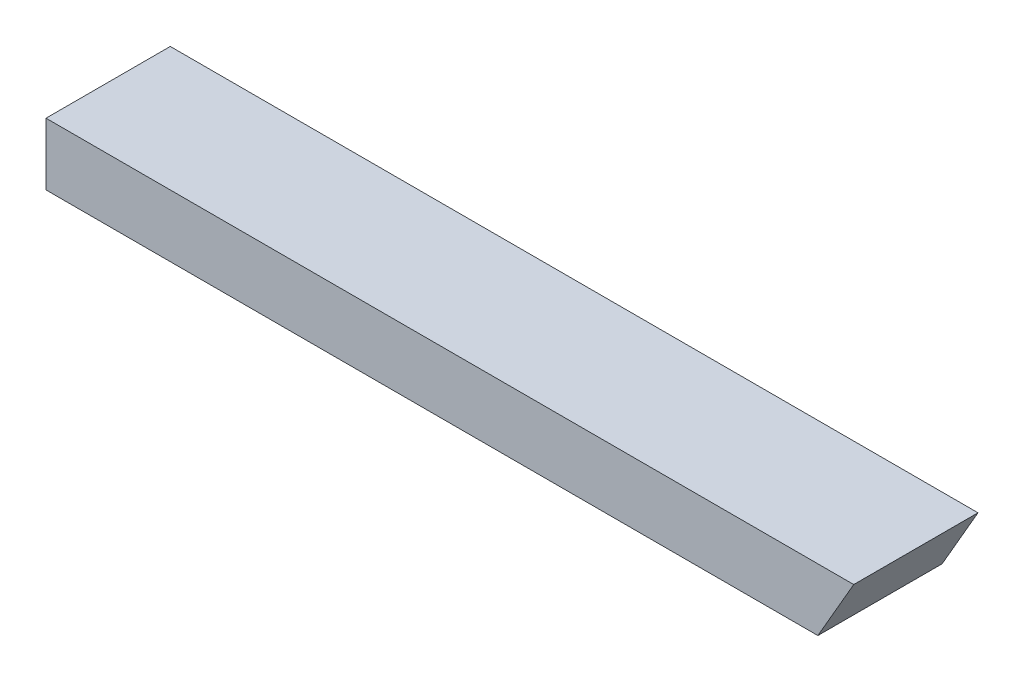
ISO-10303-21;
HEADER;
FILE_DESCRIPTION(('STEP AP214'),'2;1');
FILE_NAME('part.step','',(''),(''),'','','');
FILE_SCHEMA(('AUTOMOTIVE_DESIGN { 1 0 10303 214 1 1 1 1 }'));
ENDSEC;
DATA;
#1=APPLICATION_CONTEXT('core data for automotive mechanical design processes');
#2=APPLICATION_PROTOCOL_DEFINITION('international standard','automotive_design',2000,#1);
#3=PRODUCT_CONTEXT('',#1,'mechanical');
#4=PRODUCT('Part','Part','',(#3));
#5=PRODUCT_RELATED_PRODUCT_CATEGORY('part','',(#4));
#6=PRODUCT_DEFINITION_FORMATION('','',#4);
#7=PRODUCT_DEFINITION_CONTEXT('part definition',#1,'design');
#8=PRODUCT_DEFINITION('design','',#6,#7);
#9=PRODUCT_DEFINITION_SHAPE('','',#8);
#10=(LENGTH_UNIT() NAMED_UNIT(*) SI_UNIT(.MILLI.,.METRE.));
#11=(NAMED_UNIT(*) PLANE_ANGLE_UNIT() SI_UNIT($,.RADIAN.));
#12=(NAMED_UNIT(*) SI_UNIT($,.STERADIAN.) SOLID_ANGLE_UNIT());
#13=UNCERTAINTY_MEASURE_WITH_UNIT(LENGTH_MEASURE(1.E-05),#10,'distance_accuracy_value','');
#14=(GEOMETRIC_REPRESENTATION_CONTEXT(3) GLOBAL_UNCERTAINTY_ASSIGNED_CONTEXT((#13)) GLOBAL_UNIT_ASSIGNED_CONTEXT((#10,
#11,#12)) REPRESENTATION_CONTEXT('',''));
#15=CARTESIAN_POINT('',(0.,0.,0.));
#16=DIRECTION('',(0.,0.,1.));
#17=DIRECTION('',(1.,0.,0.));
#18=AXIS2_PLACEMENT_3D('',#15,#16,#17);
#19=CARTESIAN_POINT('',(-41.275,3.175,-6.35));
#20=DIRECTION('',(0.,0.,1.));
#21=DIRECTION('',(1.,0.,0.));
#22=AXIS2_PLACEMENT_3D('',#19,#20,#21);
#23=PLANE('',#22);
#24=DIRECTION('',(-1.,0.,0.));
#25=VECTOR('',#24,1.);
#26=CARTESIAN_POINT('',(-41.275,3.175,-6.35));
#27=LINE('',#26,#25);
#28=CARTESIAN_POINT('',(41.275,3.175,-6.35000000000001));
#29=VERTEX_POINT('',#28);
#30=CARTESIAN_POINT('',(-41.275,3.175,-6.35));
#31=VERTEX_POINT('',#30);
#32=EDGE_CURVE('E92',#29,#31,#27,.T.);
#33=ORIENTED_EDGE('',*,*,#32,.F.);
#34=DIRECTION('',(-0.500000000000002,-0.866025403784438,0.));
#35=VECTOR('',#34,1.);
#36=CARTESIAN_POINT('',(20.6374999999999,-32.5701985412028,-6.35));
#37=LINE('',#36,#35);
#38=CARTESIAN_POINT('',(37.6088257906458,-3.175,-6.35000000000001));
#39=VERTEX_POINT('',#38);
#40=EDGE_CURVE('E96',#29,#39,#37,.T.);
#41=ORIENTED_EDGE('',*,*,#40,.T.);
#42=DIRECTION('',(-1.,0.,0.));
#43=VECTOR('',#42,1.);
#44=CARTESIAN_POINT('',(-41.275,-3.175,-6.35));
#45=LINE('',#44,#43);
#46=CARTESIAN_POINT('',(-41.275,-3.175,-6.35));
#47=VERTEX_POINT('',#46);
#48=EDGE_CURVE('E81',#39,#47,#45,.T.);
#49=ORIENTED_EDGE('',*,*,#48,.T.);
#50=DIRECTION('',(0.,-1.,0.));
#51=VECTOR('',#50,1.);
#52=CARTESIAN_POINT('',(-41.275,3.175,-6.35));
#53=LINE('',#52,#51);
#54=EDGE_CURVE('E43',#31,#47,#53,.T.);
#55=ORIENTED_EDGE('',*,*,#54,.F.);
#56=EDGE_LOOP('',(#33,#41,#49,#55));
#57=FACE_BOUND('',#56,.T.);
#58=ADVANCED_FACE('F36',(#57),#23,.F.);
#59=CARTESIAN_POINT('',(-41.275,3.175,6.35));
#60=DIRECTION('',(1.,0.,0.));
#61=DIRECTION('',(0.,0.,-1.));
#62=AXIS2_PLACEMENT_3D('',#59,#60,#61);
#63=PLANE('',#62);
#64=DIRECTION('',(0.,0.,1.));
#65=VECTOR('',#64,1.);
#66=CARTESIAN_POINT('',(-41.275,-3.175,6.35));
#67=LINE('',#66,#65);
#68=CARTESIAN_POINT('',(-41.275,-3.175,6.35));
#69=VERTEX_POINT('',#68);
#70=EDGE_CURVE('E71',#47,#69,#67,.T.);
#71=ORIENTED_EDGE('',*,*,#70,.T.);
#72=DIRECTION('',(0.,-1.,0.));
#73=VECTOR('',#72,1.);
#74=CARTESIAN_POINT('',(-41.275,3.175,6.35));
#75=LINE('',#74,#73);
#76=CARTESIAN_POINT('',(-41.275,3.175,6.35));
#77=VERTEX_POINT('',#76);
#78=EDGE_CURVE('E74',#77,#69,#75,.T.);
#79=ORIENTED_EDGE('',*,*,#78,.F.);
#80=DIRECTION('',(0.,0.,1.));
#81=VECTOR('',#80,1.);
#82=CARTESIAN_POINT('',(-41.275,3.175,6.35));
#83=LINE('',#82,#81);
#84=EDGE_CURVE('E58',#31,#77,#83,.T.);
#85=ORIENTED_EDGE('',*,*,#84,.F.);
#86=ORIENTED_EDGE('',*,*,#54,.T.);
#87=EDGE_LOOP('',(#71,#79,#85,#86));
#88=FACE_BOUND('',#87,.T.);
#89=ADVANCED_FACE('F73',(#88),#63,.F.);
#90=CARTESIAN_POINT('',(-41.275,3.175,6.35));
#91=DIRECTION('',(0.,0.,-1.));
#92=DIRECTION('',(-1.,0.,0.));
#93=AXIS2_PLACEMENT_3D('',#90,#91,#92);
#94=PLANE('',#93);
#95=DIRECTION('',(1.,0.,0.));
#96=VECTOR('',#95,1.);
#97=CARTESIAN_POINT('',(-41.275,-3.175,6.35));
#98=LINE('',#97,#96);
#99=CARTESIAN_POINT('',(37.6088257906458,-3.175,6.35));
#100=VERTEX_POINT('',#99);
#101=EDGE_CURVE('E80',#69,#100,#98,.T.);
#102=ORIENTED_EDGE('',*,*,#101,.T.);
#103=DIRECTION('',(0.500000000000002,0.866025403784438,0.));
#104=VECTOR('',#103,1.);
#105=CARTESIAN_POINT('',(20.6374999999999,-32.5701985412028,6.35));
#106=LINE('',#105,#104);
#107=CARTESIAN_POINT('',(41.275,3.175,6.34999999999999));
#108=VERTEX_POINT('',#107);
#109=EDGE_CURVE('E49',#100,#108,#106,.T.);
#110=ORIENTED_EDGE('',*,*,#109,.T.);
#111=DIRECTION('',(1.,0.,0.));
#112=VECTOR('',#111,1.);
#113=CARTESIAN_POINT('',(-41.275,3.175,6.35));
#114=LINE('',#113,#112);
#115=EDGE_CURVE('E86',#77,#108,#114,.T.);
#116=ORIENTED_EDGE('',*,*,#115,.F.);
#117=ORIENTED_EDGE('',*,*,#78,.T.);
#118=EDGE_LOOP('',(#102,#110,#116,#117));
#119=FACE_BOUND('',#118,.T.);
#120=ADVANCED_FACE('F85',(#119),#94,.F.);
#121=CARTESIAN_POINT('',(0.,3.175,0.));
#122=DIRECTION('',(0.,-1.,0.));
#123=DIRECTION('',(0.,0.,-1.));
#124=AXIS2_PLACEMENT_3D('',#121,#122,#123);
#125=PLANE('',#124);
#126=DIRECTION('',(0.,0.,-1.));
#127=VECTOR('',#126,1.);
#128=CARTESIAN_POINT('',(41.275,3.175,6.35));
#129=LINE('',#128,#127);
#130=EDGE_CURVE('E89',#108,#29,#129,.T.);
#131=ORIENTED_EDGE('',*,*,#130,.T.);
#132=ORIENTED_EDGE('',*,*,#32,.T.);
#133=ORIENTED_EDGE('',*,*,#84,.T.);
#134=ORIENTED_EDGE('',*,*,#115,.T.);
#135=EDGE_LOOP('',(#131,#132,#133,#134));
#136=FACE_BOUND('',#135,.T.);
#137=ADVANCED_FACE('F105',(#136),#125,.F.);
#138=CARTESIAN_POINT('',(0.,-3.175,0.));
#139=DIRECTION('',(0.,-1.,0.));
#140=DIRECTION('',(0.,0.,-1.));
#141=AXIS2_PLACEMENT_3D('',#138,#139,#140);
#142=PLANE('',#141);
#143=DIRECTION('',(0.,0.,-1.));
#144=VECTOR('',#143,1.);
#145=CARTESIAN_POINT('',(37.6088257906458,-3.175,0.));
#146=LINE('',#145,#144);
#147=EDGE_CURVE('E11',#100,#39,#146,.T.);
#148=ORIENTED_EDGE('',*,*,#147,.F.);
#149=ORIENTED_EDGE('',*,*,#101,.F.);
#150=ORIENTED_EDGE('',*,*,#70,.F.);
#151=ORIENTED_EDGE('',*,*,#48,.F.);
#152=EDGE_LOOP('',(#148,#149,#150,#151));
#153=FACE_BOUND('',#152,.T.);
#154=ADVANCED_FACE('F88',(#153),#142,.T.);
#155=CARTESIAN_POINT('',(41.275,3.175,-24.765));
#156=DIRECTION('',(-0.866025403784438,0.500000000000002,0.));
#157=DIRECTION('',(-0.500000000000002,-0.866025403784438,0.));
#158=AXIS2_PLACEMENT_3D('',#155,#156,#157);
#159=PLANE('',#158);
#160=ORIENTED_EDGE('',*,*,#130,.F.);
#161=ORIENTED_EDGE('',*,*,#109,.F.);
#162=ORIENTED_EDGE('',*,*,#147,.T.);
#163=ORIENTED_EDGE('',*,*,#40,.F.);
#164=EDGE_LOOP('',(#160,#161,#162,#163));
#165=FACE_BOUND('',#164,.T.);
#166=ADVANCED_FACE('F109',(#165),#159,.F.);
#167=CLOSED_SHELL('',(#58,#89,#120,#137,#154,#166));
#168=MANIFOLD_SOLID_BREP('B2',#167);
#169=ADVANCED_BREP_SHAPE_REPRESENTATION('',(#18,#168),#14);
#170=SHAPE_DEFINITION_REPRESENTATION(#9,#169);
ENDSEC;
END-ISO-10303-21;
